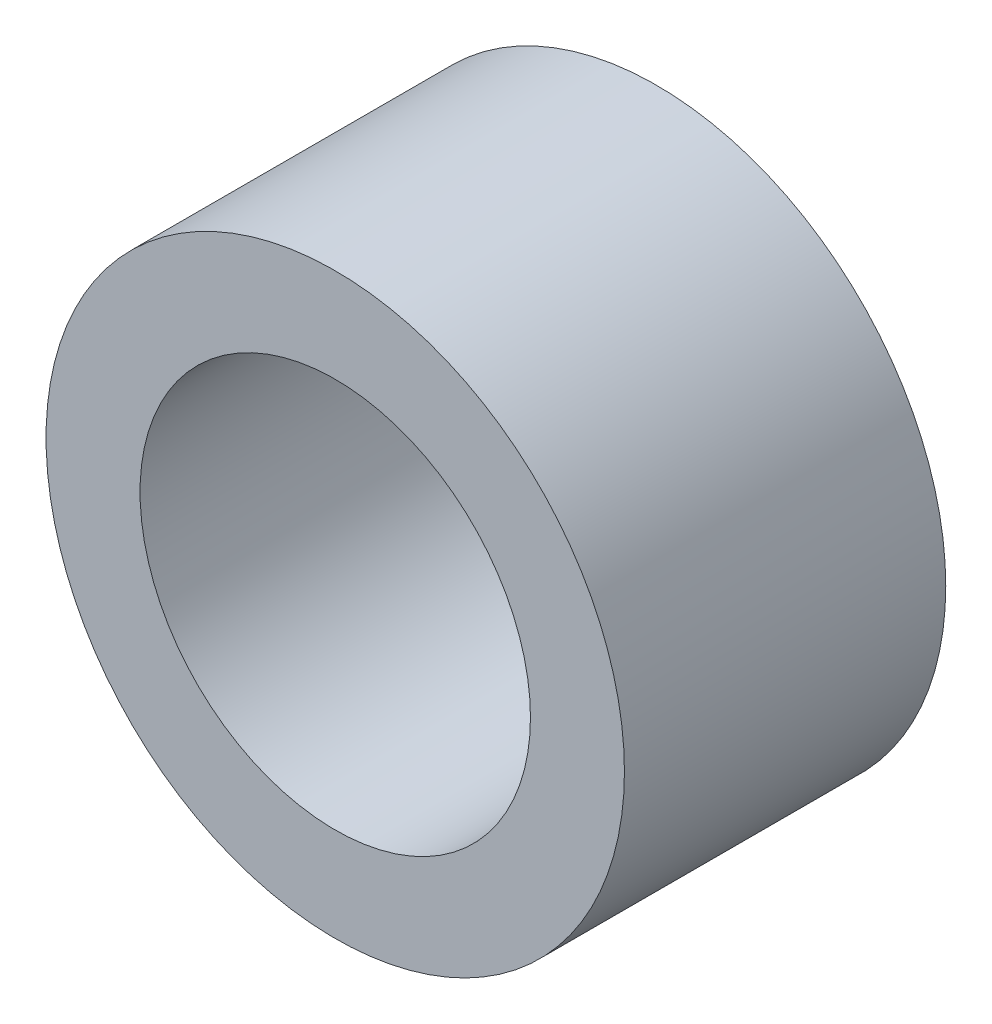
ISO-10303-21;
HEADER;
FILE_DESCRIPTION(('STEP AP214'),'2;1');
FILE_NAME('part.step','',(''),(''),'','','');
FILE_SCHEMA(('AUTOMOTIVE_DESIGN { 1 0 10303 214 1 1 1 1 }'));
ENDSEC;
DATA;
#1=APPLICATION_CONTEXT('core data for automotive mechanical design processes');
#2=APPLICATION_PROTOCOL_DEFINITION('international standard','automotive_design',2000,#1);
#3=PRODUCT_CONTEXT('',#1,'mechanical');
#4=PRODUCT('Part','Part','',(#3));
#5=PRODUCT_RELATED_PRODUCT_CATEGORY('part','',(#4));
#6=PRODUCT_DEFINITION_FORMATION('','',#4);
#7=PRODUCT_DEFINITION_CONTEXT('part definition',#1,'design');
#8=PRODUCT_DEFINITION('design','',#6,#7);
#9=PRODUCT_DEFINITION_SHAPE('','',#8);
#10=(LENGTH_UNIT() NAMED_UNIT(*) SI_UNIT(.MILLI.,.METRE.));
#11=(NAMED_UNIT(*) PLANE_ANGLE_UNIT() SI_UNIT($,.RADIAN.));
#12=(NAMED_UNIT(*) SI_UNIT($,.STERADIAN.) SOLID_ANGLE_UNIT());
#13=UNCERTAINTY_MEASURE_WITH_UNIT(LENGTH_MEASURE(1.E-05),#10,'distance_accuracy_value','');
#14=(GEOMETRIC_REPRESENTATION_CONTEXT(3) GLOBAL_UNCERTAINTY_ASSIGNED_CONTEXT((#13)) GLOBAL_UNIT_ASSIGNED_CONTEXT((#10,
#11,#12)) REPRESENTATION_CONTEXT('',''));
#15=CARTESIAN_POINT('',(0.,0.,0.));
#16=DIRECTION('',(0.,0.,1.));
#17=DIRECTION('',(1.,0.,0.));
#18=AXIS2_PLACEMENT_3D('',#15,#16,#17);
#19=CARTESIAN_POINT('',(0.,0.,40.));
#20=DIRECTION('',(0.,0.,1.));
#21=DIRECTION('',(1.,0.,0.));
#22=AXIS2_PLACEMENT_3D('',#19,#20,#21);
#23=PLANE('',#22);
#24=CARTESIAN_POINT('',(0.,0.,40.));
#25=DIRECTION('',(0.,0.,1.));
#26=DIRECTION('',(1.,0.,0.));
#27=AXIS2_PLACEMENT_3D('',#24,#25,#26);
#28=CIRCLE('',#27,36.);
#29=CARTESIAN_POINT('',(36.,0.,40.));
#30=VERTEX_POINT('',#29);
#31=EDGE_CURVE('E10',#30,#30,#28,.T.);
#32=ORIENTED_EDGE('',*,*,#31,.T.);
#33=EDGE_LOOP('',(#32));
#34=FACE_BOUND('',#33,.T.);
#35=CARTESIAN_POINT('',(0.,0.,40.));
#36=DIRECTION('',(0.,0.,1.));
#37=DIRECTION('',(1.,0.,0.));
#38=AXIS2_PLACEMENT_3D('',#35,#36,#37);
#39=CIRCLE('',#38,24.3);
#40=CARTESIAN_POINT('',(24.3,0.,40.));
#41=VERTEX_POINT('',#40);
#42=EDGE_CURVE('E54',#41,#41,#39,.T.);
#43=ORIENTED_EDGE('',*,*,#42,.F.);
#44=EDGE_LOOP('',(#43));
#45=FACE_BOUND('',#44,.T.);
#46=ADVANCED_FACE('F43',(#34,#45),#23,.T.);
#47=CARTESIAN_POINT('',(0.,0.,0.));
#48=DIRECTION('',(0.,0.,1.));
#49=DIRECTION('',(1.,0.,0.));
#50=AXIS2_PLACEMENT_3D('',#47,#48,#49);
#51=PLANE('',#50);
#52=CARTESIAN_POINT('',(0.,0.,0.));
#53=DIRECTION('',(0.,0.,1.));
#54=DIRECTION('',(1.,0.,0.));
#55=AXIS2_PLACEMENT_3D('',#52,#53,#54);
#56=CIRCLE('',#55,36.);
#57=CARTESIAN_POINT('',(36.,0.,0.));
#58=VERTEX_POINT('',#57);
#59=EDGE_CURVE('E47',#58,#58,#56,.T.);
#60=ORIENTED_EDGE('',*,*,#59,.F.);
#61=EDGE_LOOP('',(#60));
#62=FACE_BOUND('',#61,.T.);
#63=CARTESIAN_POINT('',(0.,0.,0.));
#64=DIRECTION('',(0.,0.,1.));
#65=DIRECTION('',(1.,0.,0.));
#66=AXIS2_PLACEMENT_3D('',#63,#64,#65);
#67=CIRCLE('',#66,24.3);
#68=CARTESIAN_POINT('',(24.3,0.,0.));
#69=VERTEX_POINT('',#68);
#70=EDGE_CURVE('E56',#69,#69,#67,.T.);
#71=ORIENTED_EDGE('',*,*,#70,.T.);
#72=EDGE_LOOP('',(#71));
#73=FACE_BOUND('',#72,.T.);
#74=ADVANCED_FACE('F66',(#62,#73),#51,.F.);
#75=CARTESIAN_POINT('',(0.,0.,40.));
#76=DIRECTION('',(0.,0.,-1.));
#77=DIRECTION('',(-1.,0.,0.));
#78=AXIS2_PLACEMENT_3D('',#75,#76,#77);
#79=CYLINDRICAL_SURFACE('',#78,36.);
#80=ORIENTED_EDGE('',*,*,#31,.F.);
#81=EDGE_LOOP('',(#80));
#82=FACE_BOUND('',#81,.T.);
#83=ORIENTED_EDGE('',*,*,#59,.T.);
#84=EDGE_LOOP('',(#83));
#85=FACE_BOUND('',#84,.T.);
#86=ADVANCED_FACE('F45',(#82,#85),#79,.T.);
#87=CARTESIAN_POINT('',(0.,0.,40.));
#88=DIRECTION('',(0.,0.,-1.));
#89=DIRECTION('',(-1.,0.,0.));
#90=AXIS2_PLACEMENT_3D('',#87,#88,#89);
#91=CYLINDRICAL_SURFACE('',#90,24.3);
#92=ORIENTED_EDGE('',*,*,#42,.T.);
#93=EDGE_LOOP('',(#92));
#94=FACE_BOUND('',#93,.T.);
#95=ORIENTED_EDGE('',*,*,#70,.F.);
#96=EDGE_LOOP('',(#95));
#97=FACE_BOUND('',#96,.T.);
#98=ADVANCED_FACE('F62',(#94,#97),#91,.F.);
#99=CLOSED_SHELL('',(#46,#74,#86,#98));
#100=MANIFOLD_SOLID_BREP('B2',#99);
#101=ADVANCED_BREP_SHAPE_REPRESENTATION('',(#18,#100),#14);
#102=SHAPE_DEFINITION_REPRESENTATION(#9,#101);
ENDSEC;
END-ISO-10303-21;
